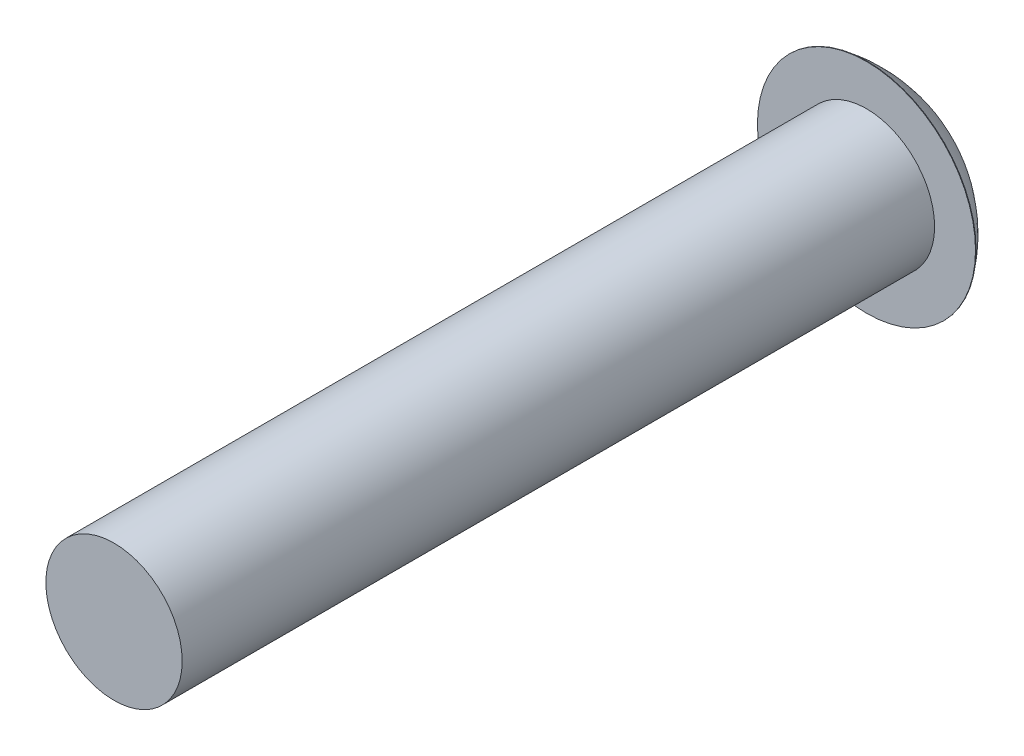
ISO-10303-21;
HEADER;
FILE_DESCRIPTION(('STEP AP214'),'2;1');
FILE_NAME('part.step','',(''),(''),'','','');
FILE_SCHEMA(('AUTOMOTIVE_DESIGN { 1 0 10303 214 1 1 1 1 }'));
ENDSEC;
DATA;
#1=APPLICATION_CONTEXT('core data for automotive mechanical design processes');
#2=APPLICATION_PROTOCOL_DEFINITION('international standard','automotive_design',2000,#1);
#3=PRODUCT_CONTEXT('',#1,'mechanical');
#4=PRODUCT('Part','Part','',(#3));
#5=PRODUCT_RELATED_PRODUCT_CATEGORY('part','',(#4));
#6=PRODUCT_DEFINITION_FORMATION('','',#4);
#7=PRODUCT_DEFINITION_CONTEXT('part definition',#1,'design');
#8=PRODUCT_DEFINITION('design','',#6,#7);
#9=PRODUCT_DEFINITION_SHAPE('','',#8);
#10=(LENGTH_UNIT() NAMED_UNIT(*) SI_UNIT(.MILLI.,.METRE.));
#11=(NAMED_UNIT(*) PLANE_ANGLE_UNIT() SI_UNIT($,.RADIAN.));
#12=(NAMED_UNIT(*) SI_UNIT($,.STERADIAN.) SOLID_ANGLE_UNIT());
#13=UNCERTAINTY_MEASURE_WITH_UNIT(LENGTH_MEASURE(1.E-05),#10,'distance_accuracy_value','');
#14=(GEOMETRIC_REPRESENTATION_CONTEXT(3) GLOBAL_UNCERTAINTY_ASSIGNED_CONTEXT((#13)) GLOBAL_UNIT_ASSIGNED_CONTEXT((#10,
#11,#12)) REPRESENTATION_CONTEXT('',''));
#15=CARTESIAN_POINT('',(0.,0.,0.));
#16=DIRECTION('',(0.,0.,1.));
#17=DIRECTION('',(1.,0.,0.));
#18=AXIS2_PLACEMENT_3D('',#15,#16,#17);
#19=CARTESIAN_POINT('',(0.,0.,17.5865256109105));
#20=DIRECTION('',(0.,0.,-1.));
#21=DIRECTION('',(-1.,0.,0.));
#22=AXIS2_PLACEMENT_3D('',#19,#20,#21);
#23=CYLINDRICAL_SURFACE('',#22,1.875);
#24=CARTESIAN_POINT('',(0.,0.,17.5865256109105));
#25=DIRECTION('',(0.,0.,1.));
#26=DIRECTION('',(1.,0.,0.));
#27=AXIS2_PLACEMENT_3D('',#24,#25,#26);
#28=CIRCLE('',#27,1.875);
#29=CARTESIAN_POINT('',(1.875,0.,17.5865256109105));
#30=VERTEX_POINT('',#29);
#31=EDGE_CURVE('E10',#30,#30,#28,.T.);
#32=ORIENTED_EDGE('',*,*,#31,.F.);
#33=EDGE_LOOP('',(#32));
#34=FACE_BOUND('',#33,.T.);
#35=CARTESIAN_POINT('',(0.,0.,-3.11347438908951));
#36=DIRECTION('',(0.,0.,1.));
#37=DIRECTION('',(1.,0.,0.));
#38=AXIS2_PLACEMENT_3D('',#35,#36,#37);
#39=CIRCLE('',#38,1.875);
#40=CARTESIAN_POINT('',(1.875,0.,-3.11347438908951));
#41=VERTEX_POINT('',#40);
#42=EDGE_CURVE('E44',#41,#41,#39,.T.);
#43=ORIENTED_EDGE('',*,*,#42,.T.);
#44=EDGE_LOOP('',(#43));
#45=FACE_BOUND('',#44,.T.);
#46=ADVANCED_FACE('F36',(#34,#45),#23,.T.);
#47=CARTESIAN_POINT('',(0.,0.,17.5865256109105));
#48=DIRECTION('',(0.,0.,1.));
#49=DIRECTION('',(1.,0.,0.));
#50=AXIS2_PLACEMENT_3D('',#47,#48,#49);
#51=PLANE('',#50);
#52=ORIENTED_EDGE('',*,*,#31,.T.);
#53=EDGE_LOOP('',(#52));
#54=FACE_BOUND('',#53,.T.);
#55=ADVANCED_FACE('F60',(#54),#51,.T.);
#56=CARTESIAN_POINT('',(0.,0.,-3.12847438908951));
#57=DIRECTION('',(0.,0.,1.));
#58=DIRECTION('',(1.,0.,0.));
#59=AXIS2_PLACEMENT_3D('',#56,#57,#58);
#60=CYLINDRICAL_SURFACE('',#59,3.);
#61=CARTESIAN_POINT('',(0.,0.,-3.12847438908951));
#62=DIRECTION('',(0.,0.,-1.));
#63=DIRECTION('',(-1.,0.,0.));
#64=AXIS2_PLACEMENT_3D('',#61,#62,#63);
#65=CIRCLE('',#64,3.);
#66=CARTESIAN_POINT('',(3.,0.,-3.12847438908951));
#67=VERTEX_POINT('',#66);
#68=EDGE_CURVE('E40',#67,#67,#65,.T.);
#69=CARTESIAN_POINT('',(0.,0.,-3.11347438908951));
#70=DIRECTION('',(0.,0.,-1.));
#71=DIRECTION('',(-1.,0.,0.));
#72=AXIS2_PLACEMENT_3D('',#69,#70,#71);
#73=CIRCLE('',#72,3.);
#74=CARTESIAN_POINT('',(3.,0.,-3.11347438908951));
#75=VERTEX_POINT('',#74);
#76=EDGE_CURVE('E50',#75,#75,#73,.T.);
#77=CARTESIAN_POINT('',(3.,0.,-3.12847438908951));
#78=CARTESIAN_POINT('',(3.,0.,-3.12831813908951));
#79=CARTESIAN_POINT('',(3.,0.,-3.12816188908951));
#80=CARTESIAN_POINT('',(3.,0.,-3.12784938908951));
#81=CARTESIAN_POINT('',(3.,0.,-3.12769313908951));
#82=CARTESIAN_POINT('',(3.,0.,-3.12738063908951));
#83=CARTESIAN_POINT('',(3.,0.,-3.12722438908951));
#84=CARTESIAN_POINT('',(3.,0.,-3.12691188908951));
#85=CARTESIAN_POINT('',(3.,0.,-3.12675563908951));
#86=CARTESIAN_POINT('',(3.,0.,-3.12644313908951));
#87=CARTESIAN_POINT('',(3.,0.,-3.12628688908951));
#88=CARTESIAN_POINT('',(3.,0.,-3.12597438908951));
#89=CARTESIAN_POINT('',(3.,0.,-3.12581813908951));
#90=CARTESIAN_POINT('',(3.,0.,-3.12550563908951));
#91=CARTESIAN_POINT('',(3.,0.,-3.12534938908951));
#92=CARTESIAN_POINT('',(3.,0.,-3.12503688908951));
#93=CARTESIAN_POINT('',(3.,0.,-3.12488063908951));
#94=CARTESIAN_POINT('',(3.,0.,-3.12456813908951));
#95=CARTESIAN_POINT('',(3.,0.,-3.12441188908951));
#96=CARTESIAN_POINT('',(3.,0.,-3.12409938908951));
#97=CARTESIAN_POINT('',(3.,0.,-3.12394313908951));
#98=CARTESIAN_POINT('',(3.,0.,-3.12363063908951));
#99=CARTESIAN_POINT('',(3.,0.,-3.12347438908951));
#100=CARTESIAN_POINT('',(3.,0.,-3.12316188908951));
#101=CARTESIAN_POINT('',(3.,0.,-3.12300563908951));
#102=CARTESIAN_POINT('',(3.,0.,-3.12269313908951));
#103=CARTESIAN_POINT('',(3.,0.,-3.12253688908951));
#104=CARTESIAN_POINT('',(3.,0.,-3.12222438908951));
#105=CARTESIAN_POINT('',(3.,0.,-3.12206813908951));
#106=CARTESIAN_POINT('',(3.,0.,-3.12175563908951));
#107=CARTESIAN_POINT('',(3.,0.,-3.12159938908951));
#108=CARTESIAN_POINT('',(3.,0.,-3.12128688908951));
#109=CARTESIAN_POINT('',(3.,0.,-3.12113063908951));
#110=CARTESIAN_POINT('',(3.,0.,-3.12081813908951));
#111=CARTESIAN_POINT('',(3.,0.,-3.12066188908951));
#112=CARTESIAN_POINT('',(3.,0.,-3.12034938908951));
#113=CARTESIAN_POINT('',(3.,0.,-3.12019313908951));
#114=CARTESIAN_POINT('',(3.,0.,-3.11988063908951));
#115=CARTESIAN_POINT('',(3.,0.,-3.11972438908951));
#116=CARTESIAN_POINT('',(3.,0.,-3.11941188908951));
#117=CARTESIAN_POINT('',(3.,0.,-3.11925563908951));
#118=CARTESIAN_POINT('',(3.,0.,-3.11894313908951));
#119=CARTESIAN_POINT('',(3.,0.,-3.11878688908951));
#120=CARTESIAN_POINT('',(3.,0.,-3.11847438908951));
#121=CARTESIAN_POINT('',(3.,0.,-3.11831813908951));
#122=CARTESIAN_POINT('',(3.,0.,-3.11800563908951));
#123=CARTESIAN_POINT('',(3.,0.,-3.11784938908951));
#124=CARTESIAN_POINT('',(3.,0.,-3.11753688908951));
#125=CARTESIAN_POINT('',(3.,0.,-3.11738063908951));
#126=CARTESIAN_POINT('',(3.,0.,-3.11706813908951));
#127=CARTESIAN_POINT('',(3.,0.,-3.11691188908951));
#128=CARTESIAN_POINT('',(3.,0.,-3.11659938908951));
#129=CARTESIAN_POINT('',(3.,0.,-3.11644313908951));
#130=CARTESIAN_POINT('',(3.,0.,-3.11613063908951));
#131=CARTESIAN_POINT('',(3.,0.,-3.11597438908951));
#132=CARTESIAN_POINT('',(3.,0.,-3.11566188908951));
#133=CARTESIAN_POINT('',(3.,0.,-3.11550563908951));
#134=CARTESIAN_POINT('',(3.,0.,-3.11519313908951));
#135=CARTESIAN_POINT('',(3.,0.,-3.11503688908951));
#136=CARTESIAN_POINT('',(3.,0.,-3.11472438908951));
#137=CARTESIAN_POINT('',(3.,0.,-3.11456813908951));
#138=CARTESIAN_POINT('',(3.,0.,-3.11425563908951));
#139=CARTESIAN_POINT('',(3.,0.,-3.11409938908951));
#140=CARTESIAN_POINT('',(3.,0.,-3.11378688908951));
#141=CARTESIAN_POINT('',(3.,0.,-3.11363063908951));
#142=CARTESIAN_POINT('',(3.,0.,-3.11347438908951));
#143=B_SPLINE_CURVE_WITH_KNOTS('',3,(#77,#78,#79,#80,#81,#82,#83,#84,#85,#86,#87,#88,#89,#90,
#91,#92,#93,#94,#95,#96,#97,#98,#99,#100,#101,#102,#103,#104,#105,#106,#107,#108,#109,#110,#111,
#112,#113,#114,#115,#116,#117,#118,#119,#120,#121,#122,#123,#124,#125,#126,#127,#128,#129,#130,
#131,#132,#133,#134,#135,#136,#137,#138,#139,#140,#141,#142),.UNSPECIFIED.,.F.,.F.,(4,2,2,2,2,2,
2,2,2,2,2,2,2,2,2,2,2,2,2,2,2,2,2,2,2,2,2,2,2,2,2,2,4),(0.,0.000468749999999601,
0.000937499999999637,0.00140624999999967,0.00187499999999971,0.00234374999999974,
0.00281249999999978,0.00328124999999981,0.00374999999999985,0.00421874999999988,
0.00468749999999992,0.00515624999999995,0.00562499999999999,0.00609375000000002,
0.00656250000000006,0.00703125000000009,0.00750000000000013,0.00796874999999973,
0.00843749999999976,0.0089062499999998,0.00937499999999983,0.00984374999999987,
0.0103124999999999,0.0107812499999999,0.01125,0.01171875,0.0121875,0.0126562500000001,
0.0131250000000001,0.0135937500000002,0.0140625000000002,0.0145312500000002,0.0150000000000003),.UNSPECIFIED.);
#144=EDGE_CURVE('BSEAM58',#67,#75,#143,.T.);
#145=ORIENTED_EDGE('',*,*,#68,.F.);
#146=ORIENTED_EDGE('',*,*,#76,.T.);
#147=ORIENTED_EDGE('',*,*,#144,.T.);
#148=ORIENTED_EDGE('',*,*,#144,.F.);
#149=EDGE_LOOP('',(#145,#147,#146,#148));
#150=FACE_BOUND('',#149,.T.);
#151=ADVANCED_FACE('F58',(#150),#60,.T.);
#152=CARTESIAN_POINT('',(0.,0.,-0.878474389089508));
#153=DIRECTION('',(0.,0.,1.));
#154=DIRECTION('',(1.,0.,0.));
#155=AXIS2_PLACEMENT_3D('',#152,#153,#154);
#156=SPHERICAL_SURFACE('',#155,3.75);
#157=ORIENTED_EDGE('',*,*,#68,.T.);
#158=EDGE_LOOP('',(#157));
#159=FACE_BOUND('',#158,.T.);
#160=ADVANCED_FACE('F38',(#159),#156,.T.);
#161=CARTESIAN_POINT('',(0.,0.,-3.11347438908951));
#162=DIRECTION('',(0.,0.,-1.));
#163=DIRECTION('',(-1.,0.,0.));
#164=AXIS2_PLACEMENT_3D('',#161,#162,#163);
#165=PLANE('',#164);
#166=ORIENTED_EDGE('',*,*,#42,.F.);
#167=EDGE_LOOP('',(#166));
#168=FACE_BOUND('',#167,.T.);
#169=ORIENTED_EDGE('',*,*,#76,.F.);
#170=EDGE_LOOP('',(#169));
#171=FACE_BOUND('',#170,.T.);
#172=ADVANCED_FACE('F66',(#168,#171),#165,.F.);
#173=CLOSED_SHELL('',(#46,#55,#151,#160,#172));
#174=MANIFOLD_SOLID_BREP('B2',#173);
#175=ADVANCED_BREP_SHAPE_REPRESENTATION('',(#18,#174),#14);
#176=SHAPE_DEFINITION_REPRESENTATION(#9,#175);
ENDSEC;
END-ISO-10303-21;
